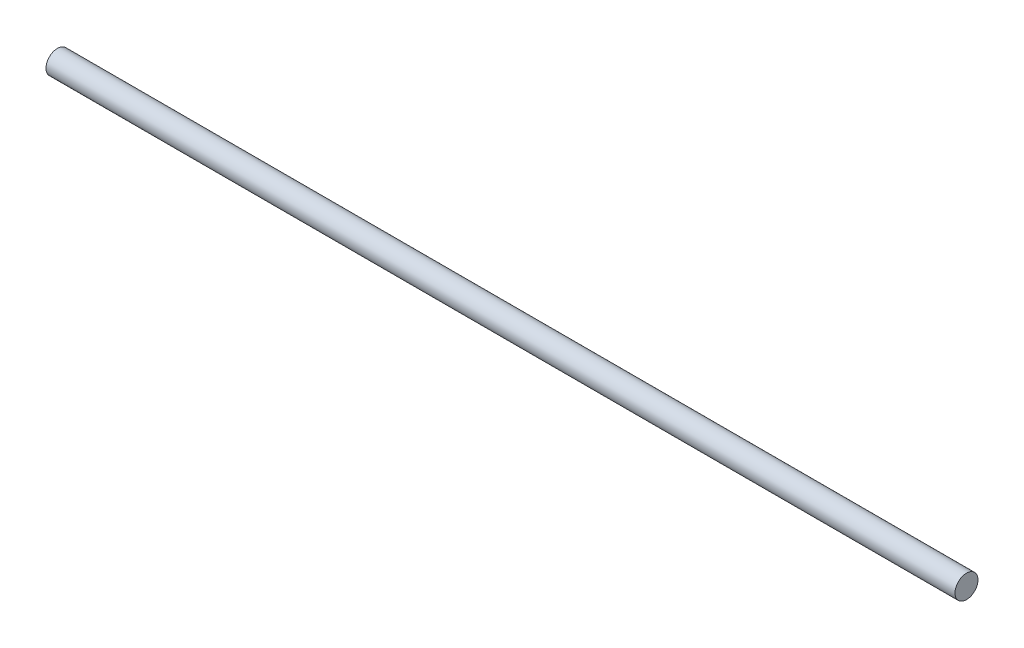
ISO-10303-21;
HEADER;
FILE_DESCRIPTION(('STEP AP214'),'2;1');
FILE_NAME('part.step','',(''),(''),'','','');
FILE_SCHEMA(('AUTOMOTIVE_DESIGN { 1 0 10303 214 1 1 1 1 }'));
ENDSEC;
DATA;
#1=APPLICATION_CONTEXT('core data for automotive mechanical design processes');
#2=APPLICATION_PROTOCOL_DEFINITION('international standard','automotive_design',2000,#1);
#3=PRODUCT_CONTEXT('',#1,'mechanical');
#4=PRODUCT('Part','Part','',(#3));
#5=PRODUCT_RELATED_PRODUCT_CATEGORY('part','',(#4));
#6=PRODUCT_DEFINITION_FORMATION('','',#4);
#7=PRODUCT_DEFINITION_CONTEXT('part definition',#1,'design');
#8=PRODUCT_DEFINITION('design','',#6,#7);
#9=PRODUCT_DEFINITION_SHAPE('','',#8);
#10=(LENGTH_UNIT() NAMED_UNIT(*) SI_UNIT(.MILLI.,.METRE.));
#11=(NAMED_UNIT(*) PLANE_ANGLE_UNIT() SI_UNIT($,.RADIAN.));
#12=(NAMED_UNIT(*) SI_UNIT($,.STERADIAN.) SOLID_ANGLE_UNIT());
#13=UNCERTAINTY_MEASURE_WITH_UNIT(LENGTH_MEASURE(1.E-05),#10,'distance_accuracy_value','');
#14=(GEOMETRIC_REPRESENTATION_CONTEXT(3) GLOBAL_UNCERTAINTY_ASSIGNED_CONTEXT((#13)) GLOBAL_UNIT_ASSIGNED_CONTEXT((#10,
#11,#12)) REPRESENTATION_CONTEXT('',''));
#15=CARTESIAN_POINT('',(0.,0.,0.));
#16=DIRECTION('',(0.,0.,1.));
#17=DIRECTION('',(1.,0.,0.));
#18=AXIS2_PLACEMENT_3D('',#15,#16,#17);
#19=CARTESIAN_POINT('',(501.65,0.,0.));
#20=DIRECTION('',(-1.,0.,0.));
#21=DIRECTION('',(0.,0.,1.));
#22=AXIS2_PLACEMENT_3D('',#19,#20,#21);
#23=CYLINDRICAL_SURFACE('',#22,6.35);
#24=CARTESIAN_POINT('',(501.65,0.,0.));
#25=DIRECTION('',(1.,0.,0.));
#26=DIRECTION('',(0.,0.,-1.));
#27=AXIS2_PLACEMENT_3D('',#24,#25,#26);
#28=CIRCLE('',#27,6.35);
#29=CARTESIAN_POINT('',(501.65,0.,-6.35));
#30=VERTEX_POINT('',#29);
#31=EDGE_CURVE('E10',#30,#30,#28,.T.);
#32=ORIENTED_EDGE('',*,*,#31,.F.);
#33=EDGE_LOOP('',(#32));
#34=FACE_BOUND('',#33,.T.);
#35=CARTESIAN_POINT('',(0.,0.,0.));
#36=DIRECTION('',(1.,0.,0.));
#37=DIRECTION('',(0.,0.,-1.));
#38=AXIS2_PLACEMENT_3D('',#35,#36,#37);
#39=CIRCLE('',#38,6.35);
#40=CARTESIAN_POINT('',(0.,0.,-6.35));
#41=VERTEX_POINT('',#40);
#42=EDGE_CURVE('E37',#41,#41,#39,.T.);
#43=ORIENTED_EDGE('',*,*,#42,.T.);
#44=EDGE_LOOP('',(#43));
#45=FACE_BOUND('',#44,.T.);
#46=ADVANCED_FACE('F40',(#34,#45),#23,.T.);
#47=CARTESIAN_POINT('',(501.65,0.,0.));
#48=DIRECTION('',(1.,0.,0.));
#49=DIRECTION('',(0.,0.,-1.));
#50=AXIS2_PLACEMENT_3D('',#47,#48,#49);
#51=PLANE('',#50);
#52=ORIENTED_EDGE('',*,*,#31,.T.);
#53=EDGE_LOOP('',(#52));
#54=FACE_BOUND('',#53,.T.);
#55=ADVANCED_FACE('F55',(#54),#51,.T.);
#56=CARTESIAN_POINT('',(0.,0.,0.));
#57=DIRECTION('',(1.,0.,0.));
#58=DIRECTION('',(0.,0.,-1.));
#59=AXIS2_PLACEMENT_3D('',#56,#57,#58);
#60=PLANE('',#59);
#61=ORIENTED_EDGE('',*,*,#42,.F.);
#62=EDGE_LOOP('',(#61));
#63=FACE_BOUND('',#62,.T.);
#64=ADVANCED_FACE('F49',(#63),#60,.F.);
#65=CLOSED_SHELL('',(#46,#55,#64));
#66=MANIFOLD_SOLID_BREP('B2',#65);
#67=ADVANCED_BREP_SHAPE_REPRESENTATION('',(#18,#66),#14);
#68=SHAPE_DEFINITION_REPRESENTATION(#9,#67);
ENDSEC;
END-ISO-10303-21;
